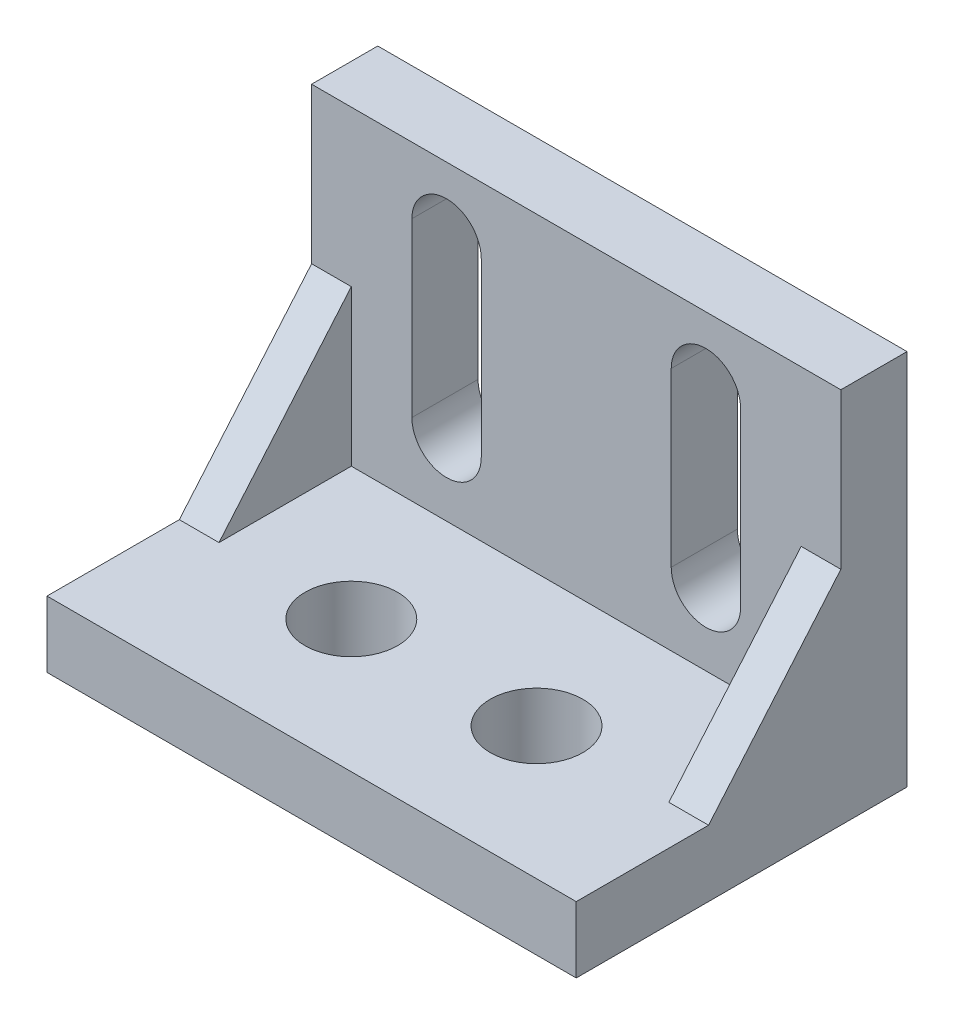
ISO-10303-21;
HEADER;
FILE_DESCRIPTION(('STEP AP214'),'2;1');
FILE_NAME('part.step','',(''),(''),'','','');
FILE_SCHEMA(('AUTOMOTIVE_DESIGN { 1 0 10303 214 1 1 1 1 }'));
ENDSEC;
DATA;
#1=APPLICATION_CONTEXT('core data for automotive mechanical design processes');
#2=APPLICATION_PROTOCOL_DEFINITION('international standard','automotive_design',2000,#1);
#3=PRODUCT_CONTEXT('',#1,'mechanical');
#4=PRODUCT('Part','Part','',(#3));
#5=PRODUCT_RELATED_PRODUCT_CATEGORY('part','',(#4));
#6=PRODUCT_DEFINITION_FORMATION('','',#4);
#7=PRODUCT_DEFINITION_CONTEXT('part definition',#1,'design');
#8=PRODUCT_DEFINITION('design','',#6,#7);
#9=PRODUCT_DEFINITION_SHAPE('','',#8);
#10=(LENGTH_UNIT() NAMED_UNIT(*) SI_UNIT(.MILLI.,.METRE.));
#11=(NAMED_UNIT(*) PLANE_ANGLE_UNIT() SI_UNIT($,.RADIAN.));
#12=(NAMED_UNIT(*) SI_UNIT($,.STERADIAN.) SOLID_ANGLE_UNIT());
#13=UNCERTAINTY_MEASURE_WITH_UNIT(LENGTH_MEASURE(1.E-05),#10,'distance_accuracy_value','');
#14=(GEOMETRIC_REPRESENTATION_CONTEXT(3) GLOBAL_UNCERTAINTY_ASSIGNED_CONTEXT((#13)) GLOBAL_UNIT_ASSIGNED_CONTEXT((#10,
#11,#12)) REPRESENTATION_CONTEXT('',''));
#15=CARTESIAN_POINT('',(0.,0.,0.));
#16=DIRECTION('',(0.,0.,1.));
#17=DIRECTION('',(1.,0.,0.));
#18=AXIS2_PLACEMENT_3D('',#15,#16,#17);
#19=CARTESIAN_POINT('',(-10.,-8.43966328995041,12.5));
#20=DIRECTION('',(0.,-1.,0.));
#21=DIRECTION('',(0.,0.,-1.));
#22=AXIS2_PLACEMENT_3D('',#19,#20,#21);
#23=PLANE('',#22);
#24=DIRECTION('',(-1.,0.,0.));
#25=VECTOR('',#24,1.);
#26=CARTESIAN_POINT('',(-8.5,-8.43966328995041,7.5));
#27=LINE('',#26,#25);
#28=CARTESIAN_POINT('',(-8.5,-8.43966328995041,7.5));
#29=VERTEX_POINT('',#28);
#30=CARTESIAN_POINT('',(-10.,-8.43966328995041,7.5));
#31=VERTEX_POINT('',#30);
#32=EDGE_CURVE('E172',#29,#31,#27,.T.);
#33=ORIENTED_EDGE('',*,*,#32,.T.);
#34=DIRECTION('',(0.,0.,-1.));
#35=VECTOR('',#34,1.);
#36=CARTESIAN_POINT('',(-10.,-8.43966328995041,12.5));
#37=LINE('',#36,#35);
#38=CARTESIAN_POINT('',(-10.,-8.43966328995041,12.5));
#39=VERTEX_POINT('',#38);
#40=EDGE_CURVE('E222',#39,#31,#37,.T.);
#41=ORIENTED_EDGE('',*,*,#40,.F.);
#42=DIRECTION('',(-1.,0.,0.));
#43=VECTOR('',#42,1.);
#44=CARTESIAN_POINT('',(-10.,-8.43966328995041,12.5));
#45=LINE('',#44,#43);
#46=CARTESIAN_POINT('',(10.,-8.43966328995041,12.5));
#47=VERTEX_POINT('',#46);
#48=EDGE_CURVE('E220',#47,#39,#45,.T.);
#49=ORIENTED_EDGE('',*,*,#48,.F.);
#50=DIRECTION('',(0.,0.,-1.));
#51=VECTOR('',#50,1.);
#52=CARTESIAN_POINT('',(10.,-8.43966328995041,12.5));
#53=LINE('',#52,#51);
#54=CARTESIAN_POINT('',(10.,-8.43966328995041,7.5));
#55=VERTEX_POINT('',#54);
#56=EDGE_CURVE('E230',#47,#55,#53,.T.);
#57=ORIENTED_EDGE('',*,*,#56,.T.);
#58=DIRECTION('',(1.,0.,0.));
#59=VECTOR('',#58,1.);
#60=CARTESIAN_POINT('',(8.5,-8.43966328995041,7.5));
#61=LINE('',#60,#59);
#62=CARTESIAN_POINT('',(8.5,-8.43966328995041,7.5));
#63=VERTEX_POINT('',#62);
#64=EDGE_CURVE('E208',#63,#55,#61,.T.);
#65=ORIENTED_EDGE('',*,*,#64,.F.);
#66=DIRECTION('',(0.,0.,-1.));
#67=VECTOR('',#66,1.);
#68=CARTESIAN_POINT('',(8.5,-8.43966328995042,2.5));
#69=LINE('',#68,#67);
#70=CARTESIAN_POINT('',(8.5,-8.43966328995041,2.5));
#71=VERTEX_POINT('',#70);
#72=EDGE_CURVE('E200',#63,#71,#69,.T.);
#73=ORIENTED_EDGE('',*,*,#72,.T.);
#74=DIRECTION('',(-1.,0.,0.));
#75=VECTOR('',#74,1.);
#76=CARTESIAN_POINT('',(-10.,-8.43966328995041,2.5));
#77=LINE('',#76,#75);
#78=CARTESIAN_POINT('',(-8.5,-8.43966328995042,2.5));
#79=VERTEX_POINT('',#78);
#80=EDGE_CURVE('E183',#71,#79,#77,.T.);
#81=ORIENTED_EDGE('',*,*,#80,.T.);
#82=DIRECTION('',(0.,0.,-1.));
#83=VECTOR('',#82,1.);
#84=CARTESIAN_POINT('',(-8.5,-8.43966328995042,2.5));
#85=LINE('',#84,#83);
#86=EDGE_CURVE('E165',#29,#79,#85,.T.);
#87=ORIENTED_EDGE('',*,*,#86,.F.);
#88=EDGE_LOOP('',(#33,#41,#49,#57,#65,#73,#81,#87));
#89=FACE_BOUND('',#88,.T.);
#90=CARTESIAN_POINT('',(3.5,-8.43966328995041,7.5));
#91=DIRECTION('',(0.,1.,0.));
#92=DIRECTION('',(0.,0.,1.));
#93=AXIS2_PLACEMENT_3D('',#90,#91,#92);
#94=CIRCLE('',#93,1.75);
#95=CARTESIAN_POINT('',(3.5,-8.43966328995041,9.25));
#96=VERTEX_POINT('',#95);
#97=EDGE_CURVE('E192',#96,#96,#94,.T.);
#98=ORIENTED_EDGE('',*,*,#97,.F.);
#99=EDGE_LOOP('',(#98));
#100=FACE_BOUND('',#99,.T.);
#101=CARTESIAN_POINT('',(-3.5,-8.43966328995041,7.5));
#102=DIRECTION('',(0.,-1.,0.));
#103=DIRECTION('',(0.,0.,1.));
#104=AXIS2_PLACEMENT_3D('',#101,#102,#103);
#105=CIRCLE('',#104,1.75);
#106=CARTESIAN_POINT('',(-3.5,-8.43966328995041,9.25));
#107=VERTEX_POINT('',#106);
#108=EDGE_CURVE('E188',#107,#107,#105,.T.);
#109=ORIENTED_EDGE('',*,*,#108,.T.);
#110=EDGE_LOOP('',(#109));
#111=FACE_BOUND('',#110,.T.);
#112=ADVANCED_FACE('F35',(#89,#100,#111),#23,.F.);
#113=CARTESIAN_POINT('',(-10.,-10.9396632899504,2.5));
#114=DIRECTION('',(0.,1.,0.));
#115=DIRECTION('',(-1.,0.,0.));
#116=AXIS2_PLACEMENT_3D('',#113,#114,#115);
#117=PLANE('',#116);
#118=DIRECTION('',(1.,0.,0.));
#119=VECTOR('',#118,1.);
#120=CARTESIAN_POINT('',(-10.,-10.9396632899504,0.));
#121=LINE('',#120,#119);
#122=CARTESIAN_POINT('',(-10.,-10.9396632899504,0.));
#123=VERTEX_POINT('',#122);
#124=CARTESIAN_POINT('',(10.,-10.9396632899504,0.));
#125=VERTEX_POINT('',#124);
#126=EDGE_CURVE('E253',#123,#125,#121,.T.);
#127=ORIENTED_EDGE('',*,*,#126,.T.);
#128=DIRECTION('',(0.,0.,-1.));
#129=VECTOR('',#128,1.);
#130=CARTESIAN_POINT('',(10.,-10.9396632899504,2.5));
#131=LINE('',#130,#129);
#132=CARTESIAN_POINT('',(10.,-10.9396632899504,12.5));
#133=VERTEX_POINT('',#132);
#134=EDGE_CURVE('E239',#133,#125,#131,.T.);
#135=ORIENTED_EDGE('',*,*,#134,.F.);
#136=DIRECTION('',(1.,0.,0.));
#137=VECTOR('',#136,1.);
#138=CARTESIAN_POINT('',(-10.,-10.9396632899504,12.5));
#139=LINE('',#138,#137);
#140=CARTESIAN_POINT('',(-10.,-10.9396632899504,12.5));
#141=VERTEX_POINT('',#140);
#142=EDGE_CURVE('E215',#141,#133,#139,.T.);
#143=ORIENTED_EDGE('',*,*,#142,.F.);
#144=DIRECTION('',(0.,0.,-1.));
#145=VECTOR('',#144,1.);
#146=CARTESIAN_POINT('',(-10.,-10.9396632899504,2.5));
#147=LINE('',#146,#145);
#148=EDGE_CURVE('E257',#141,#123,#147,.T.);
#149=ORIENTED_EDGE('',*,*,#148,.T.);
#150=EDGE_LOOP('',(#127,#135,#143,#149));
#151=FACE_BOUND('',#150,.T.);
#152=CARTESIAN_POINT('',(3.5,-10.9396632899504,7.5));
#153=DIRECTION('',(0.,1.,0.));
#154=DIRECTION('',(0.,0.,1.));
#155=AXIS2_PLACEMENT_3D('',#152,#153,#154);
#156=CIRCLE('',#155,1.75);
#157=CARTESIAN_POINT('',(3.5,-10.9396632899504,9.25));
#158=VERTEX_POINT('',#157);
#159=EDGE_CURVE('E194',#158,#158,#156,.T.);
#160=ORIENTED_EDGE('',*,*,#159,.T.);
#161=EDGE_LOOP('',(#160));
#162=FACE_BOUND('',#161,.T.);
#163=CARTESIAN_POINT('',(-3.5,-10.9396632899504,7.5));
#164=DIRECTION('',(0.,-1.,0.));
#165=DIRECTION('',(0.,0.,1.));
#166=AXIS2_PLACEMENT_3D('',#163,#164,#165);
#167=CIRCLE('',#166,1.75);
#168=CARTESIAN_POINT('',(-3.5,-10.9396632899504,9.25));
#169=VERTEX_POINT('',#168);
#170=EDGE_CURVE('E185',#169,#169,#167,.T.);
#171=ORIENTED_EDGE('',*,*,#170,.F.);
#172=EDGE_LOOP('',(#171));
#173=FACE_BOUND('',#172,.T.);
#174=ADVANCED_FACE('F273',(#151,#162,#173),#117,.F.);
#175=CARTESIAN_POINT('',(0.,0.,2.5));
#176=DIRECTION('',(0.,0.,-1.));
#177=DIRECTION('',(-1.,0.,0.));
#178=AXIS2_PLACEMENT_3D('',#175,#176,#177);
#179=PLANE('',#178);
#180=CARTESIAN_POINT('',(-4.89999999999999,-5.70350089695694,2.5));
#181=DIRECTION('',(0.,0.,1.));
#182=DIRECTION('',(1.,0.,0.));
#183=AXIS2_PLACEMENT_3D('',#180,#181,#182);
#184=CIRCLE('',#183,1.31066149068752);
#185=CARTESIAN_POINT('',(-6.21066149068751,-5.70350089695694,2.5));
#186=VERTEX_POINT('',#185);
#187=CARTESIAN_POINT('',(-3.58933850931248,-5.70350089695694,2.5));
#188=VERTEX_POINT('',#187);
#189=EDGE_CURVE('E355',#186,#188,#184,.T.);
#190=ORIENTED_EDGE('',*,*,#189,.F.);
#191=DIRECTION('',(0.,-1.,0.));
#192=VECTOR('',#191,1.);
#193=CARTESIAN_POINT('',(-6.21066149068751,-5.70350089695694,2.5));
#194=LINE('',#193,#192);
#195=CARTESIAN_POINT('',(-6.21066149068751,0.803500896956934,2.5));
#196=VERTEX_POINT('',#195);
#197=EDGE_CURVE('E366',#196,#186,#194,.T.);
#198=ORIENTED_EDGE('',*,*,#197,.F.);
#199=CARTESIAN_POINT('',(-4.89999999999999,0.803500896956934,2.5));
#200=DIRECTION('',(0.,0.,1.));
#201=DIRECTION('',(1.,0.,0.));
#202=AXIS2_PLACEMENT_3D('',#199,#200,#201);
#203=CIRCLE('',#202,1.31066149068752);
#204=CARTESIAN_POINT('',(-3.58933850931248,0.803500896956934,2.5));
#205=VERTEX_POINT('',#204);
#206=EDGE_CURVE('E381',#205,#196,#203,.T.);
#207=ORIENTED_EDGE('',*,*,#206,.F.);
#208=DIRECTION('',(0.,1.,0.));
#209=VECTOR('',#208,1.);
#210=CARTESIAN_POINT('',(-3.58933850931248,-5.70350089695694,2.5));
#211=LINE('',#210,#209);
#212=EDGE_CURVE('E357',#188,#205,#211,.T.);
#213=ORIENTED_EDGE('',*,*,#212,.F.);
#214=EDGE_LOOP('',(#190,#198,#207,#213));
#215=FACE_BOUND('',#214,.T.);
#216=CARTESIAN_POINT('',(4.89999999999999,-5.70350089695693,2.5));
#217=DIRECTION('',(0.,0.,1.));
#218=DIRECTION('',(1.,0.,0.));
#219=AXIS2_PLACEMENT_3D('',#216,#217,#218);
#220=CIRCLE('',#219,1.31066149068752);
#221=CARTESIAN_POINT('',(3.58933850931248,-5.70350089695693,2.5));
#222=VERTEX_POINT('',#221);
#223=CARTESIAN_POINT('',(6.21066149068751,-5.70350089695693,2.5));
#224=VERTEX_POINT('',#223);
#225=EDGE_CURVE('E225',#222,#224,#220,.T.);
#226=ORIENTED_EDGE('',*,*,#225,.F.);
#227=DIRECTION('',(0.,-1.,0.));
#228=VECTOR('',#227,1.);
#229=CARTESIAN_POINT('',(3.58933850931248,-5.70350089695693,2.5));
#230=LINE('',#229,#228);
#231=CARTESIAN_POINT('',(3.58933850931248,0.803500896956933,2.5));
#232=VERTEX_POINT('',#231);
#233=EDGE_CURVE('E399',#232,#222,#230,.T.);
#234=ORIENTED_EDGE('',*,*,#233,.F.);
#235=CARTESIAN_POINT('',(4.89999999999999,0.803500896956934,2.5));
#236=DIRECTION('',(0.,0.,1.));
#237=DIRECTION('',(1.,0.,0.));
#238=AXIS2_PLACEMENT_3D('',#235,#236,#237);
#239=CIRCLE('',#238,1.31066149068752);
#240=CARTESIAN_POINT('',(6.21066149068751,0.803500896956934,2.5));
#241=VERTEX_POINT('',#240);
#242=EDGE_CURVE('E411',#241,#232,#239,.T.);
#243=ORIENTED_EDGE('',*,*,#242,.F.);
#244=DIRECTION('',(0.,1.,0.));
#245=VECTOR('',#244,1.);
#246=CARTESIAN_POINT('',(6.21066149068751,-5.70350089695693,2.5));
#247=LINE('',#246,#245);
#248=EDGE_CURVE('E413',#224,#241,#247,.T.);
#249=ORIENTED_EDGE('',*,*,#248,.F.);
#250=EDGE_LOOP('',(#226,#234,#243,#249));
#251=FACE_BOUND('',#250,.T.);
#252=DIRECTION('',(-1.,0.,0.));
#253=VECTOR('',#252,1.);
#254=CARTESIAN_POINT('',(-8.5,-2.56401366560354,2.5));
#255=LINE('',#254,#253);
#256=CARTESIAN_POINT('',(-8.5,-2.56401366560354,2.5));
#257=VERTEX_POINT('',#256);
#258=CARTESIAN_POINT('',(-10.,-2.56401366560354,2.5));
#259=VERTEX_POINT('',#258);
#260=EDGE_CURVE('E179',#257,#259,#255,.T.);
#261=ORIENTED_EDGE('',*,*,#260,.F.);
#262=DIRECTION('',(0.,1.,0.));
#263=VECTOR('',#262,1.);
#264=CARTESIAN_POINT('',(-8.5,-2.56401366560354,2.5));
#265=LINE('',#264,#263);
#266=EDGE_CURVE('E167',#79,#257,#265,.T.);
#267=ORIENTED_EDGE('',*,*,#266,.F.);
#268=ORIENTED_EDGE('',*,*,#80,.F.);
#269=DIRECTION('',(0.,1.,0.));
#270=VECTOR('',#269,1.);
#271=CARTESIAN_POINT('',(8.5,-2.56401366560354,2.5));
#272=LINE('',#271,#270);
#273=CARTESIAN_POINT('',(8.5,-2.56401366560354,2.5));
#274=VERTEX_POINT('',#273);
#275=EDGE_CURVE('E53',#71,#274,#272,.T.);
#276=ORIENTED_EDGE('',*,*,#275,.T.);
#277=DIRECTION('',(1.,0.,0.));
#278=VECTOR('',#277,1.);
#279=CARTESIAN_POINT('',(8.5,-2.56401366560354,2.5));
#280=LINE('',#279,#278);
#281=CARTESIAN_POINT('',(10.,-2.56401366560354,2.5));
#282=VERTEX_POINT('',#281);
#283=EDGE_CURVE('E57',#274,#282,#280,.T.);
#284=ORIENTED_EDGE('',*,*,#283,.T.);
#285=DIRECTION('',(0.,1.,0.));
#286=VECTOR('',#285,1.);
#287=CARTESIAN_POINT('',(10.,-10.9396632899504,2.5));
#288=LINE('',#287,#286);
#289=CARTESIAN_POINT('',(10.,3.31163595874335,2.5));
#290=VERTEX_POINT('',#289);
#291=EDGE_CURVE('E39',#282,#290,#288,.T.);
#292=ORIENTED_EDGE('',*,*,#291,.T.);
#293=DIRECTION('',(-1.,0.,0.));
#294=VECTOR('',#293,1.);
#295=CARTESIAN_POINT('',(-10.,3.31163595874335,2.5));
#296=LINE('',#295,#294);
#297=CARTESIAN_POINT('',(-10.,3.31163595874335,2.5));
#298=VERTEX_POINT('',#297);
#299=EDGE_CURVE('E240',#290,#298,#296,.T.);
#300=ORIENTED_EDGE('',*,*,#299,.T.);
#301=DIRECTION('',(0.,-1.,0.));
#302=VECTOR('',#301,1.);
#303=CARTESIAN_POINT('',(-10.,-10.9396632899504,2.5));
#304=LINE('',#303,#302);
#305=EDGE_CURVE('E236',#298,#259,#304,.T.);
#306=ORIENTED_EDGE('',*,*,#305,.T.);
#307=EDGE_LOOP('',(#261,#267,#268,#276,#284,#292,#300,#306));
#308=FACE_BOUND('',#307,.T.);
#309=ADVANCED_FACE('F289',(#215,#251,#308),#179,.F.);
#310=CARTESIAN_POINT('',(0.,0.,0.));
#311=DIRECTION('',(0.,0.,-1.));
#312=DIRECTION('',(-1.,0.,0.));
#313=AXIS2_PLACEMENT_3D('',#310,#311,#312);
#314=PLANE('',#313);
#315=DIRECTION('',(0.,-1.,0.));
#316=VECTOR('',#315,1.);
#317=CARTESIAN_POINT('',(-6.21066149068751,-5.70350089695694,0.));
#318=LINE('',#317,#316);
#319=CARTESIAN_POINT('',(-6.21066149068751,0.803500896956934,0.));
#320=VERTEX_POINT('',#319);
#321=CARTESIAN_POINT('',(-6.21066149068751,-5.70350089695694,0.));
#322=VERTEX_POINT('',#321);
#323=EDGE_CURVE('E349',#320,#322,#318,.T.);
#324=ORIENTED_EDGE('',*,*,#323,.T.);
#325=CARTESIAN_POINT('',(-4.89999999999999,-5.70350089695694,0.));
#326=DIRECTION('',(0.,0.,1.));
#327=DIRECTION('',(1.,0.,0.));
#328=AXIS2_PLACEMENT_3D('',#325,#326,#327);
#329=CIRCLE('',#328,1.31066149068752);
#330=CARTESIAN_POINT('',(-3.58933850931248,-5.70350089695694,0.));
#331=VERTEX_POINT('',#330);
#332=EDGE_CURVE('E351',#322,#331,#329,.T.);
#333=ORIENTED_EDGE('',*,*,#332,.T.);
#334=DIRECTION('',(0.,1.,0.));
#335=VECTOR('',#334,1.);
#336=CARTESIAN_POINT('',(-3.58933850931248,-5.70350089695694,0.));
#337=LINE('',#336,#335);
#338=CARTESIAN_POINT('',(-3.58933850931248,0.803500896956934,0.));
#339=VERTEX_POINT('',#338);
#340=EDGE_CURVE('E359',#331,#339,#337,.T.);
#341=ORIENTED_EDGE('',*,*,#340,.T.);
#342=CARTESIAN_POINT('',(-4.89999999999999,0.803500896956934,0.));
#343=DIRECTION('',(0.,0.,1.));
#344=DIRECTION('',(1.,0.,0.));
#345=AXIS2_PLACEMENT_3D('',#342,#343,#344);
#346=CIRCLE('',#345,1.31066149068752);
#347=EDGE_CURVE('E353',#339,#320,#346,.T.);
#348=ORIENTED_EDGE('',*,*,#347,.T.);
#349=EDGE_LOOP('',(#324,#333,#341,#348));
#350=FACE_BOUND('',#349,.T.);
#351=DIRECTION('',(0.,1.,0.));
#352=VECTOR('',#351,1.);
#353=CARTESIAN_POINT('',(10.,-10.9396632899504,0.));
#354=LINE('',#353,#352);
#355=CARTESIAN_POINT('',(10.,3.31163595874335,0.));
#356=VERTEX_POINT('',#355);
#357=EDGE_CURVE('E245',#125,#356,#354,.T.);
#358=ORIENTED_EDGE('',*,*,#357,.F.);
#359=ORIENTED_EDGE('',*,*,#126,.F.);
#360=DIRECTION('',(0.,-1.,0.));
#361=VECTOR('',#360,1.);
#362=CARTESIAN_POINT('',(-10.,-10.9396632899504,0.));
#363=LINE('',#362,#361);
#364=CARTESIAN_POINT('',(-10.,3.31163595874335,0.));
#365=VERTEX_POINT('',#364);
#366=EDGE_CURVE('E251',#365,#123,#363,.T.);
#367=ORIENTED_EDGE('',*,*,#366,.F.);
#368=DIRECTION('',(-1.,0.,0.));
#369=VECTOR('',#368,1.);
#370=CARTESIAN_POINT('',(-10.,3.31163595874335,0.));
#371=LINE('',#370,#369);
#372=EDGE_CURVE('E248',#356,#365,#371,.T.);
#373=ORIENTED_EDGE('',*,*,#372,.F.);
#374=EDGE_LOOP('',(#358,#359,#367,#373));
#375=FACE_BOUND('',#374,.T.);
#376=DIRECTION('',(0.,-1.,0.));
#377=VECTOR('',#376,1.);
#378=CARTESIAN_POINT('',(3.58933850931248,-5.70350089695693,0.));
#379=LINE('',#378,#377);
#380=CARTESIAN_POINT('',(3.58933850931248,0.803500896956933,0.));
#381=VERTEX_POINT('',#380);
#382=CARTESIAN_POINT('',(3.58933850931248,-5.70350089695693,0.));
#383=VERTEX_POINT('',#382);
#384=EDGE_CURVE('E400',#381,#383,#379,.T.);
#385=ORIENTED_EDGE('',*,*,#384,.T.);
#386=CARTESIAN_POINT('',(4.89999999999999,-5.70350089695693,0.));
#387=DIRECTION('',(0.,0.,1.));
#388=DIRECTION('',(1.,0.,0.));
#389=AXIS2_PLACEMENT_3D('',#386,#387,#388);
#390=CIRCLE('',#389,1.31066149068752);
#391=CARTESIAN_POINT('',(6.21066149068751,-5.70350089695693,0.));
#392=VERTEX_POINT('',#391);
#393=EDGE_CURVE('E232',#383,#392,#390,.T.);
#394=ORIENTED_EDGE('',*,*,#393,.T.);
#395=DIRECTION('',(0.,1.,0.));
#396=VECTOR('',#395,1.);
#397=CARTESIAN_POINT('',(6.21066149068751,-5.70350089695693,0.));
#398=LINE('',#397,#396);
#399=CARTESIAN_POINT('',(6.21066149068751,0.803500896956934,0.));
#400=VERTEX_POINT('',#399);
#401=EDGE_CURVE('E406',#392,#400,#398,.T.);
#402=ORIENTED_EDGE('',*,*,#401,.T.);
#403=CARTESIAN_POINT('',(4.89999999999999,0.803500896956934,0.));
#404=DIRECTION('',(0.,0.,1.));
#405=DIRECTION('',(1.,0.,0.));
#406=AXIS2_PLACEMENT_3D('',#403,#404,#405);
#407=CIRCLE('',#406,1.31066149068752);
#408=EDGE_CURVE('E403',#400,#381,#407,.T.);
#409=ORIENTED_EDGE('',*,*,#408,.T.);
#410=EDGE_LOOP('',(#385,#394,#402,#409));
#411=FACE_BOUND('',#410,.T.);
#412=ADVANCED_FACE('F270',(#350,#375,#411),#314,.T.);
#413=CARTESIAN_POINT('',(10.,-10.9396632899504,2.5));
#414=DIRECTION('',(-1.,0.,0.));
#415=DIRECTION('',(0.,-1.,0.));
#416=AXIS2_PLACEMENT_3D('',#413,#414,#415);
#417=PLANE('',#416);
#418=ORIENTED_EDGE('',*,*,#291,.F.);
#419=DIRECTION('',(0.,-0.761574757983138,0.648077069493224));
#420=VECTOR('',#419,1.);
#421=CARTESIAN_POINT('',(10.,-8.43966328995041,7.5));
#422=LINE('',#421,#420);
#423=EDGE_CURVE('E197',#282,#55,#422,.T.);
#424=ORIENTED_EDGE('',*,*,#423,.T.);
#425=ORIENTED_EDGE('',*,*,#56,.F.);
#426=DIRECTION('',(0.,1.,0.));
#427=VECTOR('',#426,1.);
#428=CARTESIAN_POINT('',(10.,-10.9396632899504,12.5));
#429=LINE('',#428,#427);
#430=EDGE_CURVE('E218',#133,#47,#429,.T.);
#431=ORIENTED_EDGE('',*,*,#430,.F.);
#432=ORIENTED_EDGE('',*,*,#134,.T.);
#433=ORIENTED_EDGE('',*,*,#357,.T.);
#434=DIRECTION('',(0.,0.,-1.));
#435=VECTOR('',#434,1.);
#436=CARTESIAN_POINT('',(10.,3.31163595874335,2.5));
#437=LINE('',#436,#435);
#438=EDGE_CURVE('E11',#290,#356,#437,.T.);
#439=ORIENTED_EDGE('',*,*,#438,.F.);
#440=EDGE_LOOP('',(#418,#424,#425,#431,#432,#433,#439));
#441=FACE_BOUND('',#440,.T.);
#442=ADVANCED_FACE('F37',(#441),#417,.F.);
#443=CARTESIAN_POINT('',(-10.,3.31163595874335,2.5));
#444=DIRECTION('',(0.,-1.,0.));
#445=DIRECTION('',(0.,0.,-1.));
#446=AXIS2_PLACEMENT_3D('',#443,#444,#445);
#447=PLANE('',#446);
#448=ORIENTED_EDGE('',*,*,#372,.T.);
#449=DIRECTION('',(0.,0.,-1.));
#450=VECTOR('',#449,1.);
#451=CARTESIAN_POINT('',(-10.,3.31163595874335,2.5));
#452=LINE('',#451,#450);
#453=EDGE_CURVE('E45',#298,#365,#452,.T.);
#454=ORIENTED_EDGE('',*,*,#453,.F.);
#455=ORIENTED_EDGE('',*,*,#299,.F.);
#456=ORIENTED_EDGE('',*,*,#438,.T.);
#457=EDGE_LOOP('',(#448,#454,#455,#456));
#458=FACE_BOUND('',#457,.T.);
#459=ADVANCED_FACE('F290',(#458),#447,.F.);
#460=CARTESIAN_POINT('',(-10.,-10.9396632899504,2.5));
#461=DIRECTION('',(1.,0.,0.));
#462=DIRECTION('',(0.,1.,0.));
#463=AXIS2_PLACEMENT_3D('',#460,#461,#462);
#464=PLANE('',#463);
#465=DIRECTION('',(0.,-0.761574757983138,0.648077069493224));
#466=VECTOR('',#465,1.);
#467=CARTESIAN_POINT('',(-10.,-8.43966328995041,7.5));
#468=LINE('',#467,#466);
#469=EDGE_CURVE('E175',#259,#31,#468,.T.);
#470=ORIENTED_EDGE('',*,*,#469,.F.);
#471=ORIENTED_EDGE('',*,*,#305,.F.);
#472=ORIENTED_EDGE('',*,*,#453,.T.);
#473=ORIENTED_EDGE('',*,*,#366,.T.);
#474=ORIENTED_EDGE('',*,*,#148,.F.);
#475=DIRECTION('',(0.,-1.,0.));
#476=VECTOR('',#475,1.);
#477=CARTESIAN_POINT('',(-10.,-10.9396632899504,12.5));
#478=LINE('',#477,#476);
#479=EDGE_CURVE('E212',#39,#141,#478,.T.);
#480=ORIENTED_EDGE('',*,*,#479,.F.);
#481=ORIENTED_EDGE('',*,*,#40,.T.);
#482=EDGE_LOOP('',(#470,#471,#472,#473,#474,#480,#481));
#483=FACE_BOUND('',#482,.T.);
#484=ADVANCED_FACE('F264',(#483),#464,.F.);
#485=CARTESIAN_POINT('',(-4.89999999999999,-5.70350089695694,2.5));
#486=DIRECTION('',(0.,0.,-1.));
#487=DIRECTION('',(-1.,0.,0.));
#488=AXIS2_PLACEMENT_3D('',#485,#486,#487);
#489=CYLINDRICAL_SURFACE('',#488,1.31066149068752);
#490=ORIENTED_EDGE('',*,*,#332,.F.);
#491=DIRECTION('',(0.,0.,-1.));
#492=VECTOR('',#491,1.);
#493=CARTESIAN_POINT('',(-6.21066149068751,-5.70350089695694,2.5));
#494=LINE('',#493,#492);
#495=EDGE_CURVE('E363',#186,#322,#494,.T.);
#496=ORIENTED_EDGE('',*,*,#495,.F.);
#497=ORIENTED_EDGE('',*,*,#189,.T.);
#498=DIRECTION('',(0.,0.,-1.));
#499=VECTOR('',#498,1.);
#500=CARTESIAN_POINT('',(-3.58933850931248,-5.70350089695694,2.5));
#501=LINE('',#500,#499);
#502=EDGE_CURVE('E249',#188,#331,#501,.T.);
#503=ORIENTED_EDGE('',*,*,#502,.T.);
#504=EDGE_LOOP('',(#490,#496,#497,#503));
#505=FACE_BOUND('',#504,.T.);
#506=ADVANCED_FACE('F296',(#505),#489,.F.);
#507=CARTESIAN_POINT('',(-3.58933850931248,-5.70350089695694,2.5));
#508=DIRECTION('',(-1.,0.,0.));
#509=DIRECTION('',(0.,0.,1.));
#510=AXIS2_PLACEMENT_3D('',#507,#508,#509);
#511=PLANE('',#510);
#512=ORIENTED_EDGE('',*,*,#340,.F.);
#513=ORIENTED_EDGE('',*,*,#502,.F.);
#514=ORIENTED_EDGE('',*,*,#212,.T.);
#515=DIRECTION('',(0.,0.,-1.));
#516=VECTOR('',#515,1.);
#517=CARTESIAN_POINT('',(-3.58933850931248,0.803500896956934,2.5));
#518=LINE('',#517,#516);
#519=EDGE_CURVE('E368',#205,#339,#518,.T.);
#520=ORIENTED_EDGE('',*,*,#519,.T.);
#521=EDGE_LOOP('',(#512,#513,#514,#520));
#522=FACE_BOUND('',#521,.T.);
#523=ADVANCED_FACE('F330',(#522),#511,.T.);
#524=CARTESIAN_POINT('',(-4.89999999999999,0.803500896956934,2.5));
#525=DIRECTION('',(0.,0.,-1.));
#526=DIRECTION('',(-1.,0.,0.));
#527=AXIS2_PLACEMENT_3D('',#524,#525,#526);
#528=CYLINDRICAL_SURFACE('',#527,1.31066149068752);
#529=ORIENTED_EDGE('',*,*,#347,.F.);
#530=ORIENTED_EDGE('',*,*,#519,.F.);
#531=ORIENTED_EDGE('',*,*,#206,.T.);
#532=DIRECTION('',(0.,0.,-1.));
#533=VECTOR('',#532,1.);
#534=CARTESIAN_POINT('',(-6.21066149068751,0.803500896956934,2.5));
#535=LINE('',#534,#533);
#536=EDGE_CURVE('E365',#196,#320,#535,.T.);
#537=ORIENTED_EDGE('',*,*,#536,.T.);
#538=EDGE_LOOP('',(#529,#530,#531,#537));
#539=FACE_BOUND('',#538,.T.);
#540=ADVANCED_FACE('F326',(#539),#528,.F.);
#541=CARTESIAN_POINT('',(-6.21066149068751,-5.70350089695694,2.5));
#542=DIRECTION('',(1.,0.,0.));
#543=DIRECTION('',(0.,0.,-1.));
#544=AXIS2_PLACEMENT_3D('',#541,#542,#543);
#545=PLANE('',#544);
#546=ORIENTED_EDGE('',*,*,#323,.F.);
#547=ORIENTED_EDGE('',*,*,#536,.F.);
#548=ORIENTED_EDGE('',*,*,#197,.T.);
#549=ORIENTED_EDGE('',*,*,#495,.T.);
#550=EDGE_LOOP('',(#546,#547,#548,#549));
#551=FACE_BOUND('',#550,.T.);
#552=ADVANCED_FACE('F322',(#551),#545,.T.);
#553=CARTESIAN_POINT('',(4.89999999999999,-5.70350089695693,2.5));
#554=DIRECTION('',(0.,0.,-1.));
#555=DIRECTION('',(-1.,0.,0.));
#556=AXIS2_PLACEMENT_3D('',#553,#554,#555);
#557=CYLINDRICAL_SURFACE('',#556,1.31066149068752);
#558=ORIENTED_EDGE('',*,*,#393,.F.);
#559=DIRECTION('',(0.,0.,-1.));
#560=VECTOR('',#559,1.);
#561=CARTESIAN_POINT('',(3.58933850931248,-5.70350089695693,2.5));
#562=LINE('',#561,#560);
#563=EDGE_CURVE('E396',#222,#383,#562,.T.);
#564=ORIENTED_EDGE('',*,*,#563,.F.);
#565=ORIENTED_EDGE('',*,*,#225,.T.);
#566=DIRECTION('',(0.,0.,-1.));
#567=VECTOR('',#566,1.);
#568=CARTESIAN_POINT('',(6.21066149068751,-5.70350089695693,2.5));
#569=LINE('',#568,#567);
#570=EDGE_CURVE('E387',#224,#392,#569,.T.);
#571=ORIENTED_EDGE('',*,*,#570,.T.);
#572=EDGE_LOOP('',(#558,#564,#565,#571));
#573=FACE_BOUND('',#572,.T.);
#574=ADVANCED_FACE('F318',(#573),#557,.F.);
#575=CARTESIAN_POINT('',(6.21066149068751,-5.70350089695693,2.5));
#576=DIRECTION('',(-1.,0.,0.));
#577=DIRECTION('',(0.,-1.,0.));
#578=AXIS2_PLACEMENT_3D('',#575,#576,#577);
#579=PLANE('',#578);
#580=ORIENTED_EDGE('',*,*,#401,.F.);
#581=ORIENTED_EDGE('',*,*,#570,.F.);
#582=ORIENTED_EDGE('',*,*,#248,.T.);
#583=DIRECTION('',(0.,0.,-1.));
#584=VECTOR('',#583,1.);
#585=CARTESIAN_POINT('',(6.21066149068751,0.803500896956934,2.5));
#586=LINE('',#585,#584);
#587=EDGE_CURVE('E389',#241,#400,#586,.T.);
#588=ORIENTED_EDGE('',*,*,#587,.T.);
#589=EDGE_LOOP('',(#580,#581,#582,#588));
#590=FACE_BOUND('',#589,.T.);
#591=ADVANCED_FACE('F314',(#590),#579,.T.);
#592=CARTESIAN_POINT('',(4.89999999999999,0.803500896956934,2.5));
#593=DIRECTION('',(0.,0.,-1.));
#594=DIRECTION('',(-1.,0.,0.));
#595=AXIS2_PLACEMENT_3D('',#592,#593,#594);
#596=CYLINDRICAL_SURFACE('',#595,1.31066149068752);
#597=ORIENTED_EDGE('',*,*,#408,.F.);
#598=ORIENTED_EDGE('',*,*,#587,.F.);
#599=ORIENTED_EDGE('',*,*,#242,.T.);
#600=DIRECTION('',(0.,0.,-1.));
#601=VECTOR('',#600,1.);
#602=CARTESIAN_POINT('',(3.58933850931248,0.803500896956933,2.5));
#603=LINE('',#602,#601);
#604=EDGE_CURVE('E392',#232,#381,#603,.T.);
#605=ORIENTED_EDGE('',*,*,#604,.T.);
#606=EDGE_LOOP('',(#597,#598,#599,#605));
#607=FACE_BOUND('',#606,.T.);
#608=ADVANCED_FACE('F310',(#607),#596,.F.);
#609=CARTESIAN_POINT('',(3.58933850931248,-5.70350089695693,2.5));
#610=DIRECTION('',(1.,0.,0.));
#611=DIRECTION('',(0.,1.,0.));
#612=AXIS2_PLACEMENT_3D('',#609,#610,#611);
#613=PLANE('',#612);
#614=ORIENTED_EDGE('',*,*,#384,.F.);
#615=ORIENTED_EDGE('',*,*,#604,.F.);
#616=ORIENTED_EDGE('',*,*,#233,.T.);
#617=ORIENTED_EDGE('',*,*,#563,.T.);
#618=EDGE_LOOP('',(#614,#615,#616,#617));
#619=FACE_BOUND('',#618,.T.);
#620=ADVANCED_FACE('F307',(#619),#613,.T.);
#621=CARTESIAN_POINT('',(0.,0.,12.5));
#622=DIRECTION('',(0.,0.,-1.));
#623=DIRECTION('',(-1.,0.,0.));
#624=AXIS2_PLACEMENT_3D('',#621,#622,#623);
#625=PLANE('',#624);
#626=ORIENTED_EDGE('',*,*,#479,.T.);
#627=ORIENTED_EDGE('',*,*,#142,.T.);
#628=ORIENTED_EDGE('',*,*,#430,.T.);
#629=ORIENTED_EDGE('',*,*,#48,.T.);
#630=EDGE_LOOP('',(#626,#627,#628,#629));
#631=FACE_BOUND('',#630,.T.);
#632=ADVANCED_FACE('F282',(#631),#625,.F.);
#633=CARTESIAN_POINT('',(8.5,-8.43966328995041,7.5));
#634=DIRECTION('',(0.,0.648077069493224,0.761574757983138));
#635=DIRECTION('',(0.,-0.761574757983138,0.648077069493224));
#636=AXIS2_PLACEMENT_3D('',#633,#634,#635);
#637=PLANE('',#636);
#638=ORIENTED_EDGE('',*,*,#423,.F.);
#639=ORIENTED_EDGE('',*,*,#283,.F.);
#640=DIRECTION('',(0.,-0.761574757983138,0.648077069493224));
#641=VECTOR('',#640,1.);
#642=CARTESIAN_POINT('',(8.5,-8.43966328995041,7.5));
#643=LINE('',#642,#641);
#644=EDGE_CURVE('E203',#274,#63,#643,.T.);
#645=ORIENTED_EDGE('',*,*,#644,.T.);
#646=ORIENTED_EDGE('',*,*,#64,.T.);
#647=EDGE_LOOP('',(#638,#639,#645,#646));
#648=FACE_BOUND('',#647,.T.);
#649=ADVANCED_FACE('F287',(#648),#637,.T.);
#650=CARTESIAN_POINT('',(8.5,0.,0.));
#651=DIRECTION('',(1.,0.,0.));
#652=DIRECTION('',(0.,1.,0.));
#653=AXIS2_PLACEMENT_3D('',#650,#651,#652);
#654=PLANE('',#653);
#655=ORIENTED_EDGE('',*,*,#72,.F.);
#656=ORIENTED_EDGE('',*,*,#644,.F.);
#657=ORIENTED_EDGE('',*,*,#275,.F.);
#658=EDGE_LOOP('',(#655,#656,#657));
#659=FACE_BOUND('',#658,.T.);
#660=ADVANCED_FACE('F443',(#659),#654,.F.);
#661=CARTESIAN_POINT('',(3.5,-10.9396632899504,7.5));
#662=DIRECTION('',(0.,1.,0.));
#663=DIRECTION('',(0.,0.,1.));
#664=AXIS2_PLACEMENT_3D('',#661,#662,#663);
#665=CYLINDRICAL_SURFACE('',#664,1.75);
#666=ORIENTED_EDGE('',*,*,#159,.F.);
#667=EDGE_LOOP('',(#666));
#668=FACE_BOUND('',#667,.T.);
#669=ORIENTED_EDGE('',*,*,#97,.T.);
#670=EDGE_LOOP('',(#669));
#671=FACE_BOUND('',#670,.T.);
#672=ADVANCED_FACE('F451',(#668,#671),#665,.F.);
#673=CARTESIAN_POINT('',(-8.5,-8.43966328995041,7.5));
#674=DIRECTION('',(0.,-0.648077069493224,-0.761574757983138));
#675=DIRECTION('',(0.,0.761574757983138,-0.648077069493224));
#676=AXIS2_PLACEMENT_3D('',#673,#674,#675);
#677=PLANE('',#676);
#678=ORIENTED_EDGE('',*,*,#469,.T.);
#679=ORIENTED_EDGE('',*,*,#32,.F.);
#680=DIRECTION('',(0.,-0.761574757983138,0.648077069493224));
#681=VECTOR('',#680,1.);
#682=CARTESIAN_POINT('',(-8.5,-8.43966328995041,7.5));
#683=LINE('',#682,#681);
#684=EDGE_CURVE('E161',#257,#29,#683,.T.);
#685=ORIENTED_EDGE('',*,*,#684,.F.);
#686=ORIENTED_EDGE('',*,*,#260,.T.);
#687=EDGE_LOOP('',(#678,#679,#685,#686));
#688=FACE_BOUND('',#687,.T.);
#689=ADVANCED_FACE('F173',(#688),#677,.F.);
#690=CARTESIAN_POINT('',(-8.5,0.,0.));
#691=DIRECTION('',(-1.,0.,0.));
#692=DIRECTION('',(0.,1.,0.));
#693=AXIS2_PLACEMENT_3D('',#690,#691,#692);
#694=PLANE('',#693);
#695=ORIENTED_EDGE('',*,*,#86,.T.);
#696=ORIENTED_EDGE('',*,*,#266,.T.);
#697=ORIENTED_EDGE('',*,*,#684,.T.);
#698=EDGE_LOOP('',(#695,#696,#697));
#699=FACE_BOUND('',#698,.T.);
#700=ADVANCED_FACE('F163',(#699),#694,.F.);
#701=CARTESIAN_POINT('',(-3.5,-10.9396632899504,7.5));
#702=DIRECTION('',(0.,1.,0.));
#703=DIRECTION('',(-1.,0.,0.));
#704=AXIS2_PLACEMENT_3D('',#701,#702,#703);
#705=CYLINDRICAL_SURFACE('',#704,1.75);
#706=ORIENTED_EDGE('',*,*,#170,.T.);
#707=EDGE_LOOP('',(#706));
#708=FACE_BOUND('',#707,.T.);
#709=ORIENTED_EDGE('',*,*,#108,.F.);
#710=EDGE_LOOP('',(#709));
#711=FACE_BOUND('',#710,.T.);
#712=ADVANCED_FACE('F501',(#708,#711),#705,.F.);
#713=CLOSED_SHELL('',(#112,#174,#309,#412,#442,#459,#484,#506,#523,#540,#552,#574,#591,#608,
#620,#632,#649,#660,#672,#689,#700,#712));
#714=MANIFOLD_SOLID_BREP('B2',#713);
#715=ADVANCED_BREP_SHAPE_REPRESENTATION('',(#18,#714),#14);
#716=SHAPE_DEFINITION_REPRESENTATION(#9,#715);
ENDSEC;
END-ISO-10303-21;
